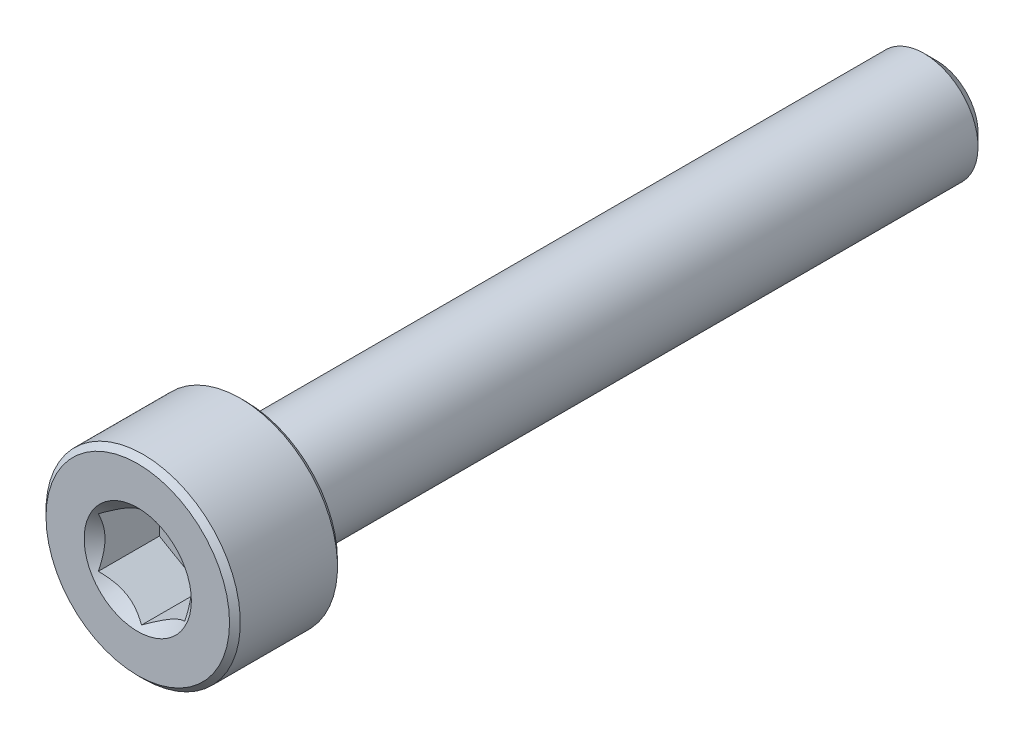
ISO-10303-21;
HEADER;
FILE_DESCRIPTION(('STEP AP214'),'2;1');
FILE_NAME('part.step','',(''),(''),'','','');
FILE_SCHEMA(('AUTOMOTIVE_DESIGN { 1 0 10303 214 1 1 1 1 }'));
ENDSEC;
DATA;
#1=APPLICATION_CONTEXT('core data for automotive mechanical design processes');
#2=APPLICATION_PROTOCOL_DEFINITION('international standard','automotive_design',2000,#1);
#3=PRODUCT_CONTEXT('',#1,'mechanical');
#4=PRODUCT('Part','Part','',(#3));
#5=PRODUCT_RELATED_PRODUCT_CATEGORY('part','',(#4));
#6=PRODUCT_DEFINITION_FORMATION('','',#4);
#7=PRODUCT_DEFINITION_CONTEXT('part definition',#1,'design');
#8=PRODUCT_DEFINITION('design','',#6,#7);
#9=PRODUCT_DEFINITION_SHAPE('','',#8);
#10=(LENGTH_UNIT() NAMED_UNIT(*) SI_UNIT(.MILLI.,.METRE.));
#11=(NAMED_UNIT(*) PLANE_ANGLE_UNIT() SI_UNIT($,.RADIAN.));
#12=(NAMED_UNIT(*) SI_UNIT($,.STERADIAN.) SOLID_ANGLE_UNIT());
#13=UNCERTAINTY_MEASURE_WITH_UNIT(LENGTH_MEASURE(1.E-05),#10,'distance_accuracy_value','');
#14=(GEOMETRIC_REPRESENTATION_CONTEXT(3) GLOBAL_UNCERTAINTY_ASSIGNED_CONTEXT((#13)) GLOBAL_UNIT_ASSIGNED_CONTEXT((#10,
#11,#12)) REPRESENTATION_CONTEXT('',''));
#15=CARTESIAN_POINT('',(0.,0.,0.));
#16=DIRECTION('',(0.,0.,1.));
#17=DIRECTION('',(1.,0.,0.));
#18=AXIS2_PLACEMENT_3D('',#15,#16,#17);
#19=CARTESIAN_POINT('',(0.,0.,6.625));
#20=DIRECTION('',(0.,0.,-1.));
#21=DIRECTION('',(0.,1.,0.));
#22=AXIS2_PLACEMENT_3D('',#19,#20,#21);
#23=TOROIDAL_SURFACE('',#22,1.375,0.125);
#24=CARTESIAN_POINT('',(0.,0.,6.75));
#25=DIRECTION('',(0.,0.,-1.));
#26=DIRECTION('',(0.,1.,0.));
#27=AXIS2_PLACEMENT_3D('',#24,#25,#26);
#28=CIRCLE('',#27,1.375);
#29=CARTESIAN_POINT('',(0.,1.375,6.75));
#30=VERTEX_POINT('',#29);
#31=EDGE_CURVE('E247',#30,#30,#28,.T.);
#32=ORIENTED_EDGE('',*,*,#31,.T.);
#33=EDGE_LOOP('',(#32));
#34=FACE_BOUND('',#33,.T.);
#35=CARTESIAN_POINT('',(0.,0.,6.625));
#36=DIRECTION('',(0.,0.,-1.));
#37=DIRECTION('',(0.,1.,0.));
#38=AXIS2_PLACEMENT_3D('',#35,#36,#37);
#39=CIRCLE('',#38,1.25);
#40=CARTESIAN_POINT('',(0.,1.25,6.625));
#41=VERTEX_POINT('',#40);
#42=EDGE_CURVE('E55',#41,#41,#39,.T.);
#43=ORIENTED_EDGE('',*,*,#42,.F.);
#44=EDGE_LOOP('',(#43));
#45=FACE_BOUND('',#44,.T.);
#46=ADVANCED_FACE('F50',(#34,#45),#23,.F.);
#47=CARTESIAN_POINT('',(0.,2.125,6.75));
#48=DIRECTION('',(0.,0.,-1.));
#49=DIRECTION('',(0.,1.,0.));
#50=AXIS2_PLACEMENT_3D('',#47,#48,#49);
#51=PLANE('',#50);
#52=CARTESIAN_POINT('',(0.,0.,6.75));
#53=DIRECTION('',(0.,0.,-1.));
#54=DIRECTION('',(0.,1.,0.));
#55=AXIS2_PLACEMENT_3D('',#52,#53,#54);
#56=CIRCLE('',#55,2.125);
#57=CARTESIAN_POINT('',(0.,2.125,6.75));
#58=VERTEX_POINT('',#57);
#59=EDGE_CURVE('E249',#58,#58,#56,.T.);
#60=ORIENTED_EDGE('',*,*,#59,.T.);
#61=EDGE_LOOP('',(#60));
#62=FACE_BOUND('',#61,.T.);
#63=ORIENTED_EDGE('',*,*,#31,.F.);
#64=EDGE_LOOP('',(#63));
#65=FACE_BOUND('',#64,.T.);
#66=ADVANCED_FACE('F117',(#62,#65),#51,.T.);
#67=CARTESIAN_POINT('',(0.,0.,6.75));
#68=DIRECTION('',(0.,0.,1.));
#69=DIRECTION('',(0.,-1.,0.));
#70=AXIS2_PLACEMENT_3D('',#67,#68,#69);
#71=CONICAL_SURFACE('',#70,2.125,0.78539816339745);
#72=CARTESIAN_POINT('',(0.,0.,6.875));
#73=DIRECTION('',(0.,0.,-1.));
#74=DIRECTION('',(0.,1.,0.));
#75=AXIS2_PLACEMENT_3D('',#72,#73,#74);
#76=CIRCLE('',#75,2.25);
#77=CARTESIAN_POINT('',(0.,2.25,6.875));
#78=VERTEX_POINT('',#77);
#79=EDGE_CURVE('E258',#78,#78,#76,.T.);
#80=ORIENTED_EDGE('',*,*,#79,.T.);
#81=EDGE_LOOP('',(#80));
#82=FACE_BOUND('',#81,.T.);
#83=ORIENTED_EDGE('',*,*,#59,.F.);
#84=EDGE_LOOP('',(#83));
#85=FACE_BOUND('',#84,.T.);
#86=ADVANCED_FACE('F122',(#82,#85),#71,.T.);
#87=CARTESIAN_POINT('',(0.,0.,-9.25));
#88=DIRECTION('',(0.,0.,-1.));
#89=DIRECTION('',(0.,1.,0.));
#90=AXIS2_PLACEMENT_3D('',#87,#88,#89);
#91=CYLINDRICAL_SURFACE('',#90,2.25);
#92=CARTESIAN_POINT('',(0.,0.,9.125));
#93=DIRECTION('',(0.,0.,-1.));
#94=DIRECTION('',(0.,1.,0.));
#95=AXIS2_PLACEMENT_3D('',#92,#93,#94);
#96=CIRCLE('',#95,2.25);
#97=CARTESIAN_POINT('',(0.,2.25,9.125));
#98=VERTEX_POINT('',#97);
#99=EDGE_CURVE('E237',#98,#98,#96,.T.);
#100=ORIENTED_EDGE('',*,*,#99,.T.);
#101=EDGE_LOOP('',(#100));
#102=FACE_BOUND('',#101,.T.);
#103=ORIENTED_EDGE('',*,*,#79,.F.);
#104=EDGE_LOOP('',(#103));
#105=FACE_BOUND('',#104,.T.);
#106=ADVANCED_FACE('F130',(#102,#105),#91,.T.);
#107=CARTESIAN_POINT('',(0.,0.,9.125));
#108=DIRECTION('',(0.,0.,-1.));
#109=DIRECTION('',(0.,1.,0.));
#110=AXIS2_PLACEMENT_3D('',#107,#108,#109);
#111=CONICAL_SURFACE('',#110,2.25,0.78539816339745);
#112=CARTESIAN_POINT('',(0.,0.,9.25));
#113=DIRECTION('',(0.,0.,-1.));
#114=DIRECTION('',(0.,1.,0.));
#115=AXIS2_PLACEMENT_3D('',#112,#113,#114);
#116=CIRCLE('',#115,2.125);
#117=CARTESIAN_POINT('',(0.,2.125,9.25));
#118=VERTEX_POINT('',#117);
#119=EDGE_CURVE('E234',#118,#118,#116,.T.);
#120=ORIENTED_EDGE('',*,*,#119,.T.);
#121=EDGE_LOOP('',(#120));
#122=FACE_BOUND('',#121,.T.);
#123=ORIENTED_EDGE('',*,*,#99,.F.);
#124=EDGE_LOOP('',(#123));
#125=FACE_BOUND('',#124,.T.);
#126=ADVANCED_FACE('F134',(#122,#125),#111,.T.);
#127=CARTESIAN_POINT('',(0.,0.,9.25));
#128=DIRECTION('',(0.,0.,1.));
#129=DIRECTION('',(0.,-1.,0.));
#130=AXIS2_PLACEMENT_3D('',#127,#128,#129);
#131=PLANE('',#130);
#132=CARTESIAN_POINT('',(0.,0.,9.25));
#133=DIRECTION('',(0.,0.,1.));
#134=DIRECTION('',(1.,0.,0.));
#135=AXIS2_PLACEMENT_3D('',#132,#133,#134);
#136=CIRCLE('',#135,1.2413030787577);
#137=CARTESIAN_POINT('',(1.2413030787577,0.,9.25));
#138=VERTEX_POINT('',#137);
#139=EDGE_CURVE('E12',#138,#138,#136,.T.);
#140=ORIENTED_EDGE('',*,*,#139,.F.);
#141=EDGE_LOOP('',(#140));
#142=FACE_BOUND('',#141,.T.);
#143=ORIENTED_EDGE('',*,*,#119,.F.);
#144=EDGE_LOOP('',(#143));
#145=FACE_BOUND('',#144,.T.);
#146=ADVANCED_FACE('F138',(#142,#145),#131,.T.);
#147=CARTESIAN_POINT('',(0.,0.,9.25));
#148=DIRECTION('',(0.,0.,1.));
#149=DIRECTION('',(1.,0.,0.));
#150=AXIS2_PLACEMENT_3D('',#147,#148,#149);
#151=CONICAL_SURFACE('',#150,1.2413030787577,0.78539816339745);
#152=ORIENTED_EDGE('',*,*,#139,.T.);
#153=EDGE_LOOP('',(#152));
#154=FACE_BOUND('',#153,.T.);
#155=CARTESIAN_POINT('',(-0.00019999999999932,-1.15481600843309,9.16351294699417));
#156=CARTESIAN_POINT('',(0.0341825950071814,-1.13496520795026,9.14367539044729));
#157=CARTESIAN_POINT('',(0.0691401181398255,-1.11478247255942,9.12500248026045));
#158=CARTESIAN_POINT('',(0.14042280295609,-1.07362739529219,9.09081220234471));
#159=CARTESIAN_POINT('',(0.176754750528984,-1.0526511355808,9.07531386864501));
#160=CARTESIAN_POINT('',(0.250016613803311,-1.01035337909803,9.04876476676382));
#161=CARTESIAN_POINT('',(0.286927851445414,-0.989042666109241,9.03764723361848));
#162=CARTESIAN_POINT('',(0.36156272931086,-0.945952199282691,9.02051732539774));
#163=CARTESIAN_POINT('',(0.399284088108636,-0.924173762626596,9.01449215708823));
#164=CARTESIAN_POINT('',(0.464292198417934,-0.886641312640014,9.00905801458905));
#165=CARTESIAN_POINT('',(0.491494371528172,-0.870936130672275,9.00825439793829));
#166=CARTESIAN_POINT('',(0.545846040669112,-0.839556179862848,9.00960415903844));
#167=CARTESIAN_POINT('',(0.572995523754876,-0.823881418494923,9.01175818916876));
#168=CARTESIAN_POINT('',(0.654056277326961,-0.777080970599366,9.02251443175003));
#169=CARTESIAN_POINT('',(0.707564140978428,-0.74618819111643,9.03541201603691));
#170=CARTESIAN_POINT('',(0.801476065143432,-0.691968116419649,9.06653819022373));
#171=CARTESIAN_POINT('',(0.842320523671834,-0.668386557293372,9.08313525732339));
#172=CARTESIAN_POINT('',(0.922409637381943,-0.622147085933682,9.12052238430685));
#173=CARTESIAN_POINT('',(0.961659010870437,-0.599486449584575,9.14129880143896));
#174=CARTESIAN_POINT('',(1.0002,-0.577234799135788,9.16351294699417));
#175=B_SPLINE_CURVE_WITH_KNOTS('',3,(#155,#156,#157,#158,#159,#160,#161,#162,#163,#164,#165,
#166,#167,#168,#169,#170,#171,#172,#173,#174),.UNSPECIFIED.,.F.,.F.,(4,2,2,2,2,2,2,2,2,4),(0.,
0.133237676828559,0.267252229834489,0.399137076269299,0.530689603280768,0.624814864263846,
0.718960890149133,0.907306626112097,1.05710100361789,1.20641411519286),.UNSPECIFIED.);
#176=CARTESIAN_POINT('',(0.,-1.15470053837925,9.16339745962156));
#177=VERTEX_POINT('',#176);
#178=CARTESIAN_POINT('',(1.,-0.577350269189626,9.16339745962156));
#179=VERTEX_POINT('',#178);
#180=EDGE_CURVE('E67',#177,#179,#175,.T.);
#181=ORIENTED_EDGE('',*,*,#180,.F.);
#182=CARTESIAN_POINT('',(-1.0002,-0.577234799135788,9.16351294699417));
#183=CARTESIAN_POINT('',(-0.965817404992819,-0.597085599618622,9.14367539044729));
#184=CARTESIAN_POINT('',(-0.930859881860175,-0.617268335009456,9.12500248026045));
#185=CARTESIAN_POINT('',(-0.859577197043911,-0.658423412276686,9.09081220234471));
#186=CARTESIAN_POINT('',(-0.823245249471016,-0.67939967198808,9.07531386864501));
#187=CARTESIAN_POINT('',(-0.749983386196689,-0.721697428470846,9.04876476676382));
#188=CARTESIAN_POINT('',(-0.713072148554586,-0.743008141459636,9.03764723361848));
#189=CARTESIAN_POINT('',(-0.638437270689141,-0.786098608286186,9.02051732539774));
#190=CARTESIAN_POINT('',(-0.600715911891365,-0.807877044942281,9.01449215708823));
#191=CARTESIAN_POINT('',(-0.535707801582067,-0.845409494928862,9.00905801458905));
#192=CARTESIAN_POINT('',(-0.508505628471829,-0.861114676896601,9.00825439793829));
#193=CARTESIAN_POINT('',(-0.454153959330889,-0.892494627706028,9.00960415903844));
#194=CARTESIAN_POINT('',(-0.427004476245125,-0.908169389073953,9.01175818916876));
#195=CARTESIAN_POINT('',(-0.345943722673041,-0.95496983696951,9.02251443175003));
#196=CARTESIAN_POINT('',(-0.292435859021573,-0.985862616452447,9.03541201603691));
#197=CARTESIAN_POINT('',(-0.198523934856569,-1.04008269114923,9.06653819022373));
#198=CARTESIAN_POINT('',(-0.157679476328167,-1.06366425027551,9.08313525732339));
#199=CARTESIAN_POINT('',(-0.077590362618057,-1.1099037216352,9.12052238430685));
#200=CARTESIAN_POINT('',(-0.0383409891295627,-1.1325643579843,9.14129880143896));
#201=CARTESIAN_POINT('',(0.000200000000000142,-1.15481600843309,9.16351294699417));
#202=B_SPLINE_CURVE_WITH_KNOTS('',3,(#182,#183,#184,#185,#186,#187,#188,#189,#190,#191,#192,
#193,#194,#195,#196,#197,#198,#199,#200,#201),.UNSPECIFIED.,.F.,.F.,(4,2,2,2,2,2,2,2,2,4),(0.,
0.133237676828559,0.267252229834489,0.399137076269299,0.530689603280767,0.624814864263845,
0.718960890149132,0.907306626112096,1.05710100361789,1.20641411519286),.UNSPECIFIED.);
#203=CARTESIAN_POINT('',(-1.,-0.577350269189626,9.16339745962156));
#204=VERTEX_POINT('',#203);
#205=EDGE_CURVE('E60',#204,#177,#202,.T.);
#206=ORIENTED_EDGE('',*,*,#205,.F.);
#207=CARTESIAN_POINT('',(-1.,-1.21199087789934,9.57997725527287));
#208=CARTESIAN_POINT('',(-1.,-1.18273650300522,9.55741554693661));
#209=CARTESIAN_POINT('',(-1.,-1.15332592158341,9.53505703381193));
#210=CARTESIAN_POINT('',(-1.,-1.09412680336146,9.4908320719692));
#211=CARTESIAN_POINT('',(-1.,-1.06433818018076,9.46896573899681));
#212=CARTESIAN_POINT('',(-1.,-0.97387129354152,9.4039212875776));
#213=CARTESIAN_POINT('',(-1.,-0.912535008128868,9.3616436137258));
#214=CARTESIAN_POINT('',(-1.,-0.783508251342876,9.27806824785001));
#215=CARTESIAN_POINT('',(-1.,-0.715662620346607,9.23700761033256));
#216=CARTESIAN_POINT('',(-1.,-0.576509894905892,9.16150147066945));
#217=CARTESIAN_POINT('',(-1.,-0.505215555513883,9.12703362621591));
#218=CARTESIAN_POINT('',(-1.,-0.398764046939012,9.08484878246325));
#219=CARTESIAN_POINT('',(-1.,-0.365313297980423,9.07284938948254));
#220=CARTESIAN_POINT('',(-1.,-0.297551245132093,9.05153030995286));
#221=CARTESIAN_POINT('',(-1.,-0.263239887100778,9.04221079245893));
#222=CARTESIAN_POINT('',(-1.,-0.194571067470057,9.02691167587498));
#223=CARTESIAN_POINT('',(-1.,-0.160227555987668,9.02087048308474));
#224=CARTESIAN_POINT('',(-1.,-0.0910948269867773,9.01225224503757));
#225=CARTESIAN_POINT('',(-1.,-0.0563055613802764,9.00967557676501));
#226=CARTESIAN_POINT('',(-1.,0.0117927152654014,9.00821295512037));
#227=CARTESIAN_POINT('',(-1.,0.0450983170825071,9.00916703835344));
#228=CARTESIAN_POINT('',(-1.,0.111441413420383,9.01434362211099));
#229=CARTESIAN_POINT('',(-1.,0.144478971732107,9.01856532046785));
#230=CARTESIAN_POINT('',(-1.,0.210624763290572,9.03010847896862));
#231=CARTESIAN_POINT('',(-1.,0.243723154740698,9.03748543479042));
#232=CARTESIAN_POINT('',(-1.,0.309187738497536,9.05492899920948));
#233=CARTESIAN_POINT('',(-1.,0.341553969590706,9.06499546496534));
#234=CARTESIAN_POINT('',(-1.,0.440875348086756,9.09974257065232));
#235=CARTESIAN_POINT('',(-1.,0.506480526276306,9.1282699754181));
#236=CARTESIAN_POINT('',(-1.,0.634628446237199,9.19175922476326));
#237=CARTESIAN_POINT('',(-1.,0.697159414671817,9.22674368431451));
#238=CARTESIAN_POINT('',(-1.,0.816694357126199,9.29898555821879));
#239=CARTESIAN_POINT('',(-1.,0.873818851530729,9.33604607035743));
#240=CARTESIAN_POINT('',(-1.,0.957979712513755,9.39336695643995));
#241=CARTESIAN_POINT('',(-1.,0.985671461150837,9.41268175945423));
#242=CARTESIAN_POINT('',(-1.,1.04067496120981,9.45182989264588));
#243=CARTESIAN_POINT('',(-1.,1.06798681474316,9.47166307919343));
#244=CARTESIAN_POINT('',(-1.,1.09514019811391,9.49171143685736));
#245=B_SPLINE_CURVE_WITH_KNOTS('',3,(#207,#208,#209,#210,#211,#212,#213,#214,#215,#216,#217,
#218,#219,#220,#221,#222,#223,#224,#225,#226,#227,#228,#229,#230,#231,#232,#233,#234,#235,#236,
#237,#238,#239,#240,#241,#242,#243,#244),.UNSPECIFIED.,.F.,.F.,(4,2,2,2,2,2,2,2,2,2,2,2,2,2,2,2,
2,2,4),(0.,0.110828944200309,0.221683685263868,0.445078388583646,0.682811068621038,
0.919723239940849,1.02624790401867,1.13277928653702,1.23723298361625,1.34169804566788,
1.44148938783186,1.54125623996228,1.64285505347063,1.74444847208079,1.95844200767913,
2.17319976124347,2.3773768581412,2.47865984803709,2.57991506662171),.UNSPECIFIED.);
#246=CARTESIAN_POINT('',(-1.,0.577350269189626,9.16339745962156));
#247=VERTEX_POINT('',#246);
#248=EDGE_CURVE('E176',#247,#204,#245,.F.);
#249=ORIENTED_EDGE('',*,*,#248,.F.);
#250=CARTESIAN_POINT('',(0.000199999999999444,1.15481600843309,9.16351294699417));
#251=CARTESIAN_POINT('',(-0.0341825950071814,1.13496520795026,9.14367539044729));
#252=CARTESIAN_POINT('',(-0.0691401181398255,1.11478247255942,9.12500248026045));
#253=CARTESIAN_POINT('',(-0.14042280295609,1.07362739529219,9.09081220234471));
#254=CARTESIAN_POINT('',(-0.176754750528984,1.0526511355808,9.07531386864501));
#255=CARTESIAN_POINT('',(-0.250016613803311,1.01035337909803,9.04876476676382));
#256=CARTESIAN_POINT('',(-0.286927851445415,0.989042666109241,9.03764723361848));
#257=CARTESIAN_POINT('',(-0.36156272931086,0.945952199282691,9.02051732539774));
#258=CARTESIAN_POINT('',(-0.399284088108636,0.924173762626596,9.01449215708823));
#259=CARTESIAN_POINT('',(-0.464292198417934,0.886641312640014,9.00905801458905));
#260=CARTESIAN_POINT('',(-0.491494371528172,0.870936130672275,9.00825439793829));
#261=CARTESIAN_POINT('',(-0.545846040669112,0.839556179862848,9.00960415903844));
#262=CARTESIAN_POINT('',(-0.572995523754876,0.823881418494923,9.01175818916876));
#263=CARTESIAN_POINT('',(-0.65405627732696,0.777080970599366,9.02251443175003));
#264=CARTESIAN_POINT('',(-0.707564140978428,0.74618819111643,9.03541201603691));
#265=CARTESIAN_POINT('',(-0.801476065143431,0.691968116419649,9.06653819022373));
#266=CARTESIAN_POINT('',(-0.842320523671834,0.668386557293372,9.08313525732339));
#267=CARTESIAN_POINT('',(-0.922409637381943,0.622147085933682,9.12052238430685));
#268=CARTESIAN_POINT('',(-0.961659010870437,0.599486449584575,9.14129880143896));
#269=CARTESIAN_POINT('',(-1.0002,0.577234799135788,9.16351294699417));
#270=B_SPLINE_CURVE_WITH_KNOTS('',3,(#250,#251,#252,#253,#254,#255,#256,#257,#258,#259,#260,
#261,#262,#263,#264,#265,#266,#267,#268,#269),.UNSPECIFIED.,.F.,.F.,(4,2,2,2,2,2,2,2,2,4),(0.,
0.133237676828559,0.26725222983449,0.3991370762693,0.530689603280768,0.624814864263846,
0.718960890149133,0.907306626112097,1.05710100361789,1.20641411519286),.UNSPECIFIED.);
#271=CARTESIAN_POINT('',(0.,1.15470053837925,9.16339745962156));
#272=VERTEX_POINT('',#271);
#273=EDGE_CURVE('E169',#272,#247,#270,.T.);
#274=ORIENTED_EDGE('',*,*,#273,.F.);
#275=CARTESIAN_POINT('',(1.0002,0.577234799135788,9.16351294699417));
#276=CARTESIAN_POINT('',(0.965817404992819,0.597085599618622,9.14367539044729));
#277=CARTESIAN_POINT('',(0.930859881860175,0.617268335009456,9.12500248026045));
#278=CARTESIAN_POINT('',(0.85957719704391,0.658423412276686,9.09081220234471));
#279=CARTESIAN_POINT('',(0.823245249471016,0.67939967198808,9.07531386864501));
#280=CARTESIAN_POINT('',(0.749983386196689,0.721697428470846,9.04876476676382));
#281=CARTESIAN_POINT('',(0.713072148554586,0.743008141459637,9.03764723361848));
#282=CARTESIAN_POINT('',(0.638437270689141,0.786098608286186,9.02051732539774));
#283=CARTESIAN_POINT('',(0.600715911891364,0.807877044942281,9.01449215708823));
#284=CARTESIAN_POINT('',(0.535707801582066,0.845409494928863,9.00905801458905));
#285=CARTESIAN_POINT('',(0.508505628471827,0.861114676896602,9.00825439793829));
#286=CARTESIAN_POINT('',(0.454153959330888,0.892494627706029,9.00960415903844));
#287=CARTESIAN_POINT('',(0.427004476245124,0.908169389073954,9.01175818916876));
#288=CARTESIAN_POINT('',(0.345943722673039,0.954969836969511,9.02251443175003));
#289=CARTESIAN_POINT('',(0.292435859021572,0.985862616452447,9.03541201603691));
#290=CARTESIAN_POINT('',(0.198523934856568,1.04008269114923,9.06653819022373));
#291=CARTESIAN_POINT('',(0.157679476328166,1.06366425027551,9.08313525732339));
#292=CARTESIAN_POINT('',(0.0775903626180565,1.1099037216352,9.12052238430685));
#293=CARTESIAN_POINT('',(0.0383409891295625,1.1325643579843,9.14129880143896));
#294=CARTESIAN_POINT('',(-0.000199999999999909,1.15481600843309,9.16351294699417));
#295=B_SPLINE_CURVE_WITH_KNOTS('',3,(#275,#276,#277,#278,#279,#280,#281,#282,#283,#284,#285,
#286,#287,#288,#289,#290,#291,#292,#293,#294),.UNSPECIFIED.,.F.,.F.,(4,2,2,2,2,2,2,2,2,4),(0.,
0.133237676828559,0.26725222983449,0.3991370762693,0.530689603280768,0.624814864263846,
0.718960890149133,0.907306626112097,1.05710100361789,1.20641411519286),.UNSPECIFIED.);
#296=CARTESIAN_POINT('',(1.,0.577350269189626,9.16339745962156));
#297=VERTEX_POINT('',#296);
#298=EDGE_CURVE('E160',#297,#272,#295,.T.);
#299=ORIENTED_EDGE('',*,*,#298,.F.);
#300=CARTESIAN_POINT('',(1.,-1.21199087789934,9.57997725527287));
#301=CARTESIAN_POINT('',(1.,-1.18273650300522,9.55741554693661));
#302=CARTESIAN_POINT('',(1.,-1.15332592158341,9.53505703381193));
#303=CARTESIAN_POINT('',(1.,-1.09412680336146,9.4908320719692));
#304=CARTESIAN_POINT('',(1.,-1.06433818018076,9.46896573899681));
#305=CARTESIAN_POINT('',(1.,-0.97387129354152,9.4039212875776));
#306=CARTESIAN_POINT('',(1.,-0.912535008128868,9.3616436137258));
#307=CARTESIAN_POINT('',(1.,-0.783508251342876,9.27806824785001));
#308=CARTESIAN_POINT('',(1.,-0.715662620346607,9.23700761033256));
#309=CARTESIAN_POINT('',(1.,-0.576509894905892,9.16150147066945));
#310=CARTESIAN_POINT('',(1.,-0.505215555513883,9.12703362621591));
#311=CARTESIAN_POINT('',(1.,-0.398764046939012,9.08484878246325));
#312=CARTESIAN_POINT('',(1.,-0.365313297980422,9.07284938948254));
#313=CARTESIAN_POINT('',(1.,-0.297551245132093,9.05153030995286));
#314=CARTESIAN_POINT('',(1.,-0.263239887100778,9.04221079245893));
#315=CARTESIAN_POINT('',(1.,-0.194571067470056,9.02691167587498));
#316=CARTESIAN_POINT('',(1.,-0.160227555987668,9.02087048308474));
#317=CARTESIAN_POINT('',(1.,-0.0910948269867767,9.01225224503757));
#318=CARTESIAN_POINT('',(1.,-0.0563055613802757,9.00967557676501));
#319=CARTESIAN_POINT('',(1.,0.0117927152654022,9.00821295512037));
#320=CARTESIAN_POINT('',(1.,0.0450983170825078,9.00916703835344));
#321=CARTESIAN_POINT('',(1.,0.111441413420384,9.01434362211099));
#322=CARTESIAN_POINT('',(1.,0.144478971732107,9.01856532046785));
#323=CARTESIAN_POINT('',(1.,0.210624763290572,9.03010847896862));
#324=CARTESIAN_POINT('',(1.,0.243723154740698,9.03748543479042));
#325=CARTESIAN_POINT('',(1.,0.309187738497536,9.05492899920948));
#326=CARTESIAN_POINT('',(1.,0.341553969590706,9.06499546496534));
#327=CARTESIAN_POINT('',(1.,0.440875348086756,9.09974257065232));
#328=CARTESIAN_POINT('',(1.,0.506480526276306,9.1282699754181));
#329=CARTESIAN_POINT('',(1.,0.634628446237199,9.19175922476326));
#330=CARTESIAN_POINT('',(1.,0.697159414671816,9.22674368431451));
#331=CARTESIAN_POINT('',(1.,0.816694357126198,9.29898555821879));
#332=CARTESIAN_POINT('',(1.,0.873818851530728,9.33604607035743));
#333=CARTESIAN_POINT('',(1.,0.957979712513756,9.39336695643995));
#334=CARTESIAN_POINT('',(1.,0.985671461150838,9.41268175945423));
#335=CARTESIAN_POINT('',(1.,1.04067496120981,9.45182989264588));
#336=CARTESIAN_POINT('',(1.,1.06798681474316,9.47166307919343));
#337=CARTESIAN_POINT('',(1.,1.09514019811391,9.49171143685736));
#338=B_SPLINE_CURVE_WITH_KNOTS('',3,(#300,#301,#302,#303,#304,#305,#306,#307,#308,#309,#310,
#311,#312,#313,#314,#315,#316,#317,#318,#319,#320,#321,#322,#323,#324,#325,#326,#327,#328,#329,
#330,#331,#332,#333,#334,#335,#336,#337),.UNSPECIFIED.,.F.,.F.,(4,2,2,2,2,2,2,2,2,2,2,2,2,2,2,2,
2,2,4),(0.,0.110828944200309,0.221683685263869,0.445078388583646,0.682811068621038,
0.919723239940849,1.02624790401867,1.13277928653702,1.23723298361625,1.34169804566788,
1.44148938783186,1.54125623996228,1.64285505347063,1.74444847208079,1.95844200767913,
2.17319976124347,2.3773768581412,2.47865984803709,2.57991506662171),.UNSPECIFIED.);
#339=EDGE_CURVE('E152',#179,#297,#338,.T.);
#340=ORIENTED_EDGE('',*,*,#339,.F.);
#341=EDGE_LOOP('',(#181,#206,#249,#274,#299,#340));
#342=FACE_BOUND('',#341,.T.);
#343=ADVANCED_FACE('F52',(#154,#342),#151,.F.);
#344=CARTESIAN_POINT('',(0.,2.125,7.75));
#345=DIRECTION('',(0.,0.,-1.));
#346=DIRECTION('',(0.,1.,0.));
#347=AXIS2_PLACEMENT_3D('',#344,#345,#346);
#348=PLANE('',#347);
#349=DIRECTION('',(0.866025403784438,0.5,0.));
#350=VECTOR('',#349,1.);
#351=CARTESIAN_POINT('',(0.,-1.15470053837925,7.75));
#352=LINE('',#351,#350);
#353=CARTESIAN_POINT('',(0.,-1.15470053837925,7.75));
#354=VERTEX_POINT('',#353);
#355=CARTESIAN_POINT('',(1.,-0.577350269189626,7.75));
#356=VERTEX_POINT('',#355);
#357=EDGE_CURVE('E221',#354,#356,#352,.T.);
#358=ORIENTED_EDGE('',*,*,#357,.T.);
#359=DIRECTION('',(0.,1.,0.));
#360=VECTOR('',#359,1.);
#361=CARTESIAN_POINT('',(1.,-0.577350269189626,7.75));
#362=LINE('',#361,#360);
#363=CARTESIAN_POINT('',(1.,0.577350269189626,7.75));
#364=VERTEX_POINT('',#363);
#365=EDGE_CURVE('E161',#356,#364,#362,.T.);
#366=ORIENTED_EDGE('',*,*,#365,.T.);
#367=DIRECTION('',(-0.866025403784439,0.5,0.));
#368=VECTOR('',#367,1.);
#369=CARTESIAN_POINT('',(1.,0.577350269189626,7.75));
#370=LINE('',#369,#368);
#371=CARTESIAN_POINT('',(0.,1.15470053837925,7.75));
#372=VERTEX_POINT('',#371);
#373=EDGE_CURVE('E222',#364,#372,#370,.T.);
#374=ORIENTED_EDGE('',*,*,#373,.T.);
#375=DIRECTION('',(-0.866025403784438,-0.5,0.));
#376=VECTOR('',#375,1.);
#377=CARTESIAN_POINT('',(0.,1.15470053837925,7.75));
#378=LINE('',#377,#376);
#379=CARTESIAN_POINT('',(-1.,0.577350269189626,7.75));
#380=VERTEX_POINT('',#379);
#381=EDGE_CURVE('E227',#372,#380,#378,.T.);
#382=ORIENTED_EDGE('',*,*,#381,.T.);
#383=DIRECTION('',(0.,-1.,0.));
#384=VECTOR('',#383,1.);
#385=CARTESIAN_POINT('',(-1.,0.577350269189626,7.75));
#386=LINE('',#385,#384);
#387=CARTESIAN_POINT('',(-1.,-0.577350269189626,7.75));
#388=VERTEX_POINT('',#387);
#389=EDGE_CURVE('E212',#380,#388,#386,.T.);
#390=ORIENTED_EDGE('',*,*,#389,.T.);
#391=DIRECTION('',(0.866025403784439,-0.5,0.));
#392=VECTOR('',#391,1.);
#393=CARTESIAN_POINT('',(-1.,-0.577350269189626,7.75));
#394=LINE('',#393,#392);
#395=EDGE_CURVE('E211',#388,#354,#394,.T.);
#396=ORIENTED_EDGE('',*,*,#395,.T.);
#397=EDGE_LOOP('',(#358,#366,#374,#382,#390,#396));
#398=FACE_BOUND('',#397,.T.);
#399=ADVANCED_FACE('F143',(#398),#348,.F.);
#400=CARTESIAN_POINT('',(0.,-1.15470053837925,3.69494953669611));
#401=DIRECTION('',(0.5,-0.866025403784438,0.));
#402=DIRECTION('',(0.866025403784438,0.5,0.));
#403=AXIS2_PLACEMENT_3D('',#400,#401,#402);
#404=PLANE('',#403);
#405=DIRECTION('',(0.,0.,1.));
#406=VECTOR('',#405,1.);
#407=CARTESIAN_POINT('',(0.,-1.15470053837925,3.69494953669611));
#408=LINE('',#407,#406);
#409=EDGE_CURVE('E215',#354,#177,#408,.T.);
#410=ORIENTED_EDGE('',*,*,#409,.T.);
#411=ORIENTED_EDGE('',*,*,#180,.T.);
#412=DIRECTION('',(0.,0.,1.));
#413=VECTOR('',#412,1.);
#414=CARTESIAN_POINT('',(1.,-0.577350269189626,3.69494953669611));
#415=LINE('',#414,#413);
#416=EDGE_CURVE('E230',#356,#179,#415,.T.);
#417=ORIENTED_EDGE('',*,*,#416,.F.);
#418=ORIENTED_EDGE('',*,*,#357,.F.);
#419=EDGE_LOOP('',(#410,#411,#417,#418));
#420=FACE_BOUND('',#419,.T.);
#421=ADVANCED_FACE('F145',(#420),#404,.F.);
#422=CARTESIAN_POINT('',(-1.,-0.577350269189626,3.69494953669611));
#423=DIRECTION('',(-0.5,-0.866025403784439,0.));
#424=DIRECTION('',(0.866025403784439,-0.5,0.));
#425=AXIS2_PLACEMENT_3D('',#422,#423,#424);
#426=PLANE('',#425);
#427=DIRECTION('',(0.,0.,1.));
#428=VECTOR('',#427,1.);
#429=CARTESIAN_POINT('',(-1.,-0.577350269189626,3.69494953669611));
#430=LINE('',#429,#428);
#431=EDGE_CURVE('E206',#388,#204,#430,.T.);
#432=ORIENTED_EDGE('',*,*,#431,.T.);
#433=ORIENTED_EDGE('',*,*,#205,.T.);
#434=ORIENTED_EDGE('',*,*,#409,.F.);
#435=ORIENTED_EDGE('',*,*,#395,.F.);
#436=EDGE_LOOP('',(#432,#433,#434,#435));
#437=FACE_BOUND('',#436,.T.);
#438=ADVANCED_FACE('F191',(#437),#426,.F.);
#439=CARTESIAN_POINT('',(-1.,0.577350269189626,3.69494953669611));
#440=DIRECTION('',(-1.,0.,0.));
#441=DIRECTION('',(0.,0.,1.));
#442=AXIS2_PLACEMENT_3D('',#439,#440,#441);
#443=PLANE('',#442);
#444=DIRECTION('',(0.,0.,1.));
#445=VECTOR('',#444,1.);
#446=CARTESIAN_POINT('',(-1.,0.577350269189626,3.69494953669611));
#447=LINE('',#446,#445);
#448=EDGE_CURVE('E209',#380,#247,#447,.T.);
#449=ORIENTED_EDGE('',*,*,#448,.T.);
#450=ORIENTED_EDGE('',*,*,#248,.T.);
#451=ORIENTED_EDGE('',*,*,#431,.F.);
#452=ORIENTED_EDGE('',*,*,#389,.F.);
#453=EDGE_LOOP('',(#449,#450,#451,#452));
#454=FACE_BOUND('',#453,.T.);
#455=ADVANCED_FACE('F186',(#454),#443,.F.);
#456=CARTESIAN_POINT('',(0.,1.15470053837925,3.69494953669611));
#457=DIRECTION('',(-0.5,0.866025403784438,0.));
#458=DIRECTION('',(-0.866025403784438,-0.5,0.));
#459=AXIS2_PLACEMENT_3D('',#456,#457,#458);
#460=PLANE('',#459);
#461=DIRECTION('',(0.,0.,1.));
#462=VECTOR('',#461,1.);
#463=CARTESIAN_POINT('',(0.,1.15470053837925,3.69494953669611));
#464=LINE('',#463,#462);
#465=EDGE_CURVE('E226',#372,#272,#464,.T.);
#466=ORIENTED_EDGE('',*,*,#465,.T.);
#467=ORIENTED_EDGE('',*,*,#273,.T.);
#468=ORIENTED_EDGE('',*,*,#448,.F.);
#469=ORIENTED_EDGE('',*,*,#381,.F.);
#470=EDGE_LOOP('',(#466,#467,#468,#469));
#471=FACE_BOUND('',#470,.T.);
#472=ADVANCED_FACE('F183',(#471),#460,.F.);
#473=CARTESIAN_POINT('',(1.,0.577350269189626,3.69494953669611));
#474=DIRECTION('',(0.5,0.866025403784439,0.));
#475=DIRECTION('',(-0.866025403784439,0.5,0.));
#476=AXIS2_PLACEMENT_3D('',#473,#474,#475);
#477=PLANE('',#476);
#478=DIRECTION('',(0.,0.,1.));
#479=VECTOR('',#478,1.);
#480=CARTESIAN_POINT('',(1.,0.577350269189626,3.69494953669611));
#481=LINE('',#480,#479);
#482=EDGE_CURVE('E225',#364,#297,#481,.T.);
#483=ORIENTED_EDGE('',*,*,#482,.T.);
#484=ORIENTED_EDGE('',*,*,#298,.T.);
#485=ORIENTED_EDGE('',*,*,#465,.F.);
#486=ORIENTED_EDGE('',*,*,#373,.F.);
#487=EDGE_LOOP('',(#483,#484,#485,#486));
#488=FACE_BOUND('',#487,.T.);
#489=ADVANCED_FACE('F111',(#488),#477,.F.);
#490=CARTESIAN_POINT('',(1.,-0.577350269189626,3.69494953669611));
#491=DIRECTION('',(1.,0.,0.));
#492=DIRECTION('',(0.,0.,-1.));
#493=AXIS2_PLACEMENT_3D('',#490,#491,#492);
#494=PLANE('',#493);
#495=ORIENTED_EDGE('',*,*,#416,.T.);
#496=ORIENTED_EDGE('',*,*,#339,.T.);
#497=ORIENTED_EDGE('',*,*,#482,.F.);
#498=ORIENTED_EDGE('',*,*,#365,.F.);
#499=EDGE_LOOP('',(#495,#496,#497,#498));
#500=FACE_BOUND('',#499,.T.);
#501=ADVANCED_FACE('F105',(#500),#494,.F.);
#502=CARTESIAN_POINT('',(0.,0.,5.90331216351296));
#503=DIRECTION('',(0.,0.,1.));
#504=DIRECTION('',(0.,-1.,0.));
#505=AXIS2_PLACEMENT_3D('',#502,#503,#504);
#506=CONICAL_SURFACE('',#505,0.,1.04719755119659);
#507=ORIENTED_EDGE('',*,*,#42,.T.);
#508=EDGE_LOOP('',(#507));
#509=FACE_BOUND('',#508,.T.);
#510=CARTESIAN_POINT('',(0.,0.,5.90331216351296));
#511=VERTEX_POINT('',#510);
#512=VERTEX_LOOP('',#511);
#513=FACE_BOUND('',#512,.T.);
#514=ADVANCED_FACE('F103',(#509,#513),#506,.T.);
#515=CLOSED_SHELL('',(#46,#66,#86,#106,#126,#146,#343,#399,#421,#438,#455,#472,#489,#501,#514));
#516=MANIFOLD_SOLID_BREP('B2',#515);
#517=CARTESIAN_POINT('',(-2.26,-2.25,6.625));
#518=DIRECTION('',(0.,0.,-1.));
#519=DIRECTION('',(-1.,0.,0.));
#520=AXIS2_PLACEMENT_3D('',#517,#518,#519);
#521=PLANE('',#520);
#522=CARTESIAN_POINT('',(0.,0.,6.625));
#523=DIRECTION('',(0.,0.,-1.));
#524=DIRECTION('',(0.,1.,0.));
#525=AXIS2_PLACEMENT_3D('',#522,#523,#524);
#526=CIRCLE('',#525,1.25);
#527=CARTESIAN_POINT('',(0.,1.25,6.625));
#528=VERTEX_POINT('',#527);
#529=EDGE_CURVE('E384',#528,#528,#526,.T.);
#530=ORIENTED_EDGE('',*,*,#529,.F.);
#531=EDGE_LOOP('',(#530));
#532=FACE_BOUND('',#531,.T.);
#533=ADVANCED_FACE('F374',(#532),#521,.F.);
#534=CARTESIAN_POINT('',(0.,0.957716426222752,-9.25));
#535=DIRECTION('',(0.,0.,-1.));
#536=DIRECTION('',(0.,1.,0.));
#537=AXIS2_PLACEMENT_3D('',#534,#535,#536);
#538=PLANE('',#537);
#539=CARTESIAN_POINT('',(0.,0.,-9.25));
#540=DIRECTION('',(0.,0.,-1.));
#541=DIRECTION('',(0.,1.,0.));
#542=AXIS2_PLACEMENT_3D('',#539,#540,#541);
#543=CIRCLE('',#542,0.957716426222752);
#544=CARTESIAN_POINT('',(0.,0.957716426222752,-9.25));
#545=VERTEX_POINT('',#544);
#546=EDGE_CURVE('E49',#545,#545,#543,.T.);
#547=ORIENTED_EDGE('',*,*,#546,.T.);
#548=EDGE_LOOP('',(#547));
#549=FACE_BOUND('',#548,.T.);
#550=ADVANCED_FACE('F395',(#549),#538,.T.);
#551=CARTESIAN_POINT('',(0.,0.,-9.25));
#552=DIRECTION('',(0.,0.,1.));
#553=DIRECTION('',(0.,-1.,0.));
#554=AXIS2_PLACEMENT_3D('',#551,#552,#553);
#555=CONICAL_SURFACE('',#554,0.957716426222752,0.785398163397447);
#556=CARTESIAN_POINT('',(0.,0.,-8.95771642622275));
#557=DIRECTION('',(0.,0.,-1.));
#558=DIRECTION('',(0.,1.,0.));
#559=AXIS2_PLACEMENT_3D('',#556,#557,#558);
#560=CIRCLE('',#559,1.25);
#561=CARTESIAN_POINT('',(0.,1.25,-8.95771642622275));
#562=VERTEX_POINT('',#561);
#563=EDGE_CURVE('E380',#562,#562,#560,.T.);
#564=ORIENTED_EDGE('',*,*,#563,.T.);
#565=EDGE_LOOP('',(#564));
#566=FACE_BOUND('',#565,.T.);
#567=ORIENTED_EDGE('',*,*,#546,.F.);
#568=EDGE_LOOP('',(#567));
#569=FACE_BOUND('',#568,.T.);
#570=ADVANCED_FACE('F399',(#566,#569),#555,.T.);
#571=CARTESIAN_POINT('',(0.,0.,-9.25));
#572=DIRECTION('',(0.,0.,-1.));
#573=DIRECTION('',(0.,1.,0.));
#574=AXIS2_PLACEMENT_3D('',#571,#572,#573);
#575=CYLINDRICAL_SURFACE('',#574,1.25);
#576=ORIENTED_EDGE('',*,*,#529,.T.);
#577=EDGE_LOOP('',(#576));
#578=FACE_BOUND('',#577,.T.);
#579=ORIENTED_EDGE('',*,*,#563,.F.);
#580=EDGE_LOOP('',(#579));
#581=FACE_BOUND('',#580,.T.);
#582=ADVANCED_FACE('F391',(#578,#581),#575,.T.);
#583=CLOSED_SHELL('',(#533,#550,#570,#582));
#584=MANIFOLD_SOLID_BREP('B6',#583);
#585=ADVANCED_BREP_SHAPE_REPRESENTATION('',(#18,#516,#584),#14);
#586=SHAPE_DEFINITION_REPRESENTATION(#9,#585);
ENDSEC;
END-ISO-10303-21;
